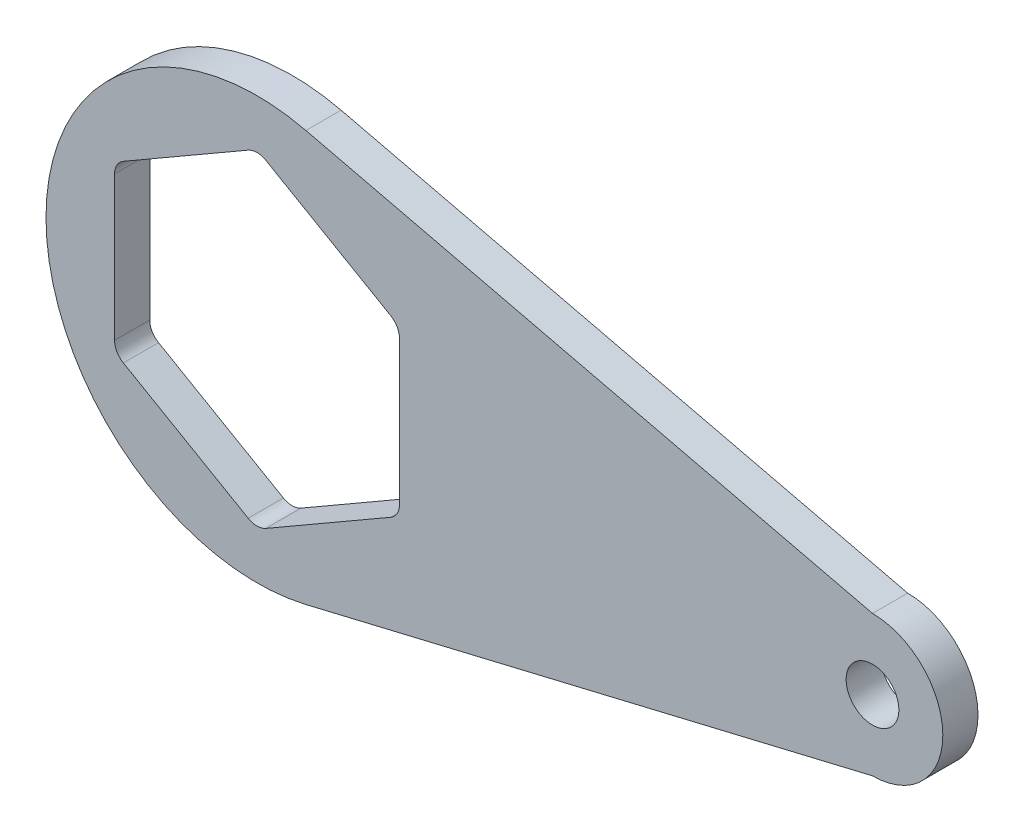
ISO-10303-21;
HEADER;
FILE_DESCRIPTION(('STEP AP214'),'2;1');
FILE_NAME('part.step','',(''),(''),'','','');
FILE_SCHEMA(('AUTOMOTIVE_DESIGN { 1 0 10303 214 1 1 1 1 }'));
ENDSEC;
DATA;
#1=APPLICATION_CONTEXT('core data for automotive mechanical design processes');
#2=APPLICATION_PROTOCOL_DEFINITION('international standard','automotive_design',2000,#1);
#3=PRODUCT_CONTEXT('',#1,'mechanical');
#4=PRODUCT('Part','Part','',(#3));
#5=PRODUCT_RELATED_PRODUCT_CATEGORY('part','',(#4));
#6=PRODUCT_DEFINITION_FORMATION('','',#4);
#7=PRODUCT_DEFINITION_CONTEXT('part definition',#1,'design');
#8=PRODUCT_DEFINITION('design','',#6,#7);
#9=PRODUCT_DEFINITION_SHAPE('','',#8);
#10=(LENGTH_UNIT() NAMED_UNIT(*) SI_UNIT(.MILLI.,.METRE.));
#11=(NAMED_UNIT(*) PLANE_ANGLE_UNIT() SI_UNIT($,.RADIAN.));
#12=(NAMED_UNIT(*) SI_UNIT($,.STERADIAN.) SOLID_ANGLE_UNIT());
#13=UNCERTAINTY_MEASURE_WITH_UNIT(LENGTH_MEASURE(1.E-05),#10,'distance_accuracy_value','');
#14=(GEOMETRIC_REPRESENTATION_CONTEXT(3) GLOBAL_UNCERTAINTY_ASSIGNED_CONTEXT((#13)) GLOBAL_UNIT_ASSIGNED_CONTEXT((#10,
#11,#12)) REPRESENTATION_CONTEXT('',''));
#15=CARTESIAN_POINT('',(0.,0.,0.));
#16=DIRECTION('',(0.,0.,1.));
#17=DIRECTION('',(1.,0.,0.));
#18=AXIS2_PLACEMENT_3D('',#15,#16,#17);
#19=CARTESIAN_POINT('',(175.,0.,10.));
#20=DIRECTION('',(0.,0.,1.));
#21=DIRECTION('',(1.,0.,0.));
#22=AXIS2_PLACEMENT_3D('',#19,#20,#21);
#23=PLANE('',#22);
#24=DIRECTION('',(0.,1.,0.));
#25=VECTOR('',#24,1.);
#26=CARTESIAN_POINT('',(40.5,-23.3826859021798,10.));
#27=LINE('',#26,#25);
#28=CARTESIAN_POINT('',(40.5,-20.4959345562317,10.));
#29=VERTEX_POINT('',#28);
#30=CARTESIAN_POINT('',(40.5,20.4959345562317,10.));
#31=VERTEX_POINT('',#30);
#32=EDGE_CURVE('E295',#29,#31,#27,.T.);
#33=ORIENTED_EDGE('',*,*,#32,.F.);
#34=CARTESIAN_POINT('',(35.5,-20.4959345562317,10.));
#35=DIRECTION('',(0.,0.,1.));
#36=DIRECTION('',(1.,0.,0.));
#37=AXIS2_PLACEMENT_3D('',#34,#35,#36);
#38=CIRCLE('',#37,5.);
#39=CARTESIAN_POINT('',(38.,-24.8260615751539,10.));
#40=VERTEX_POINT('',#39);
#41=EDGE_CURVE('E259',#29,#40,#38,.F.);
#42=ORIENTED_EDGE('',*,*,#41,.T.);
#43=DIRECTION('',(0.866025403784439,0.5,0.));
#44=VECTOR('',#43,1.);
#45=CARTESIAN_POINT('',(0.,-46.7653718043597,10.));
#46=LINE('',#45,#44);
#47=CARTESIAN_POINT('',(2.50000000000001,-45.3219961313856,10.));
#48=VERTEX_POINT('',#47);
#49=EDGE_CURVE('E312',#48,#40,#46,.T.);
#50=ORIENTED_EDGE('',*,*,#49,.F.);
#51=CARTESIAN_POINT('',(0.,-40.9918691124634,10.));
#52=DIRECTION('',(0.,0.,1.));
#53=DIRECTION('',(1.,0.,0.));
#54=AXIS2_PLACEMENT_3D('',#51,#52,#53);
#55=CIRCLE('',#54,5.);
#56=CARTESIAN_POINT('',(-2.5,-45.3219961313856,10.));
#57=VERTEX_POINT('',#56);
#58=EDGE_CURVE('E255',#48,#57,#55,.F.);
#59=ORIENTED_EDGE('',*,*,#58,.T.);
#60=DIRECTION('',(0.866025403784439,-0.5,0.));
#61=VECTOR('',#60,1.);
#62=CARTESIAN_POINT('',(-40.5,-23.3826859021799,10.));
#63=LINE('',#62,#61);
#64=CARTESIAN_POINT('',(-38.,-24.8260615751539,10.));
#65=VERTEX_POINT('',#64);
#66=EDGE_CURVE('E292',#65,#57,#63,.T.);
#67=ORIENTED_EDGE('',*,*,#66,.F.);
#68=CARTESIAN_POINT('',(-35.5,-20.4959345562317,10.));
#69=DIRECTION('',(0.,0.,1.));
#70=DIRECTION('',(1.,0.,0.));
#71=AXIS2_PLACEMENT_3D('',#68,#69,#70);
#72=CIRCLE('',#71,5.);
#73=CARTESIAN_POINT('',(-40.5,-20.4959345562317,10.));
#74=VERTEX_POINT('',#73);
#75=EDGE_CURVE('E251',#65,#74,#72,.F.);
#76=ORIENTED_EDGE('',*,*,#75,.T.);
#77=DIRECTION('',(0.,-1.,0.));
#78=VECTOR('',#77,1.);
#79=CARTESIAN_POINT('',(-40.5,23.3826859021798,10.));
#80=LINE('',#79,#78);
#81=CARTESIAN_POINT('',(-40.5,20.4959345562317,10.));
#82=VERTEX_POINT('',#81);
#83=EDGE_CURVE('E289',#82,#74,#80,.T.);
#84=ORIENTED_EDGE('',*,*,#83,.F.);
#85=CARTESIAN_POINT('',(-35.5,20.4959345562317,10.));
#86=DIRECTION('',(0.,0.,1.));
#87=DIRECTION('',(1.,0.,0.));
#88=AXIS2_PLACEMENT_3D('',#85,#86,#87);
#89=CIRCLE('',#88,5.);
#90=CARTESIAN_POINT('',(-38.,24.8260615751539,10.));
#91=VERTEX_POINT('',#90);
#92=EDGE_CURVE('E12',#82,#91,#89,.F.);
#93=ORIENTED_EDGE('',*,*,#92,.T.);
#94=DIRECTION('',(-0.866025403784438,-0.5,0.));
#95=VECTOR('',#94,1.);
#96=CARTESIAN_POINT('',(0.,46.7653718043597,10.));
#97=LINE('',#96,#95);
#98=CARTESIAN_POINT('',(-2.49999999999999,45.3219961313856,10.));
#99=VERTEX_POINT('',#98);
#100=EDGE_CURVE('E287',#99,#91,#97,.T.);
#101=ORIENTED_EDGE('',*,*,#100,.F.);
#102=CARTESIAN_POINT('',(0.,40.9918691124634,10.));
#103=DIRECTION('',(0.,0.,1.));
#104=DIRECTION('',(1.,0.,0.));
#105=AXIS2_PLACEMENT_3D('',#102,#103,#104);
#106=CIRCLE('',#105,5.);
#107=CARTESIAN_POINT('',(2.5,45.3219961313856,10.));
#108=VERTEX_POINT('',#107);
#109=EDGE_CURVE('E267',#99,#108,#106,.F.);
#110=ORIENTED_EDGE('',*,*,#109,.T.);
#111=DIRECTION('',(-0.866025403784439,0.5,0.));
#112=VECTOR('',#111,1.);
#113=CARTESIAN_POINT('',(40.5,23.3826859021798,10.));
#114=LINE('',#113,#112);
#115=CARTESIAN_POINT('',(38.,24.8260615751539,10.));
#116=VERTEX_POINT('',#115);
#117=EDGE_CURVE('E290',#116,#108,#114,.T.);
#118=ORIENTED_EDGE('',*,*,#117,.F.);
#119=CARTESIAN_POINT('',(35.5,20.4959345562317,10.));
#120=DIRECTION('',(0.,0.,1.));
#121=DIRECTION('',(1.,0.,0.));
#122=AXIS2_PLACEMENT_3D('',#119,#120,#121);
#123=CIRCLE('',#122,5.);
#124=EDGE_CURVE('E263',#116,#31,#123,.F.);
#125=ORIENTED_EDGE('',*,*,#124,.T.);
#126=EDGE_LOOP('',(#33,#42,#50,#59,#67,#76,#84,#93,#101,#110,#118,#125));
#127=FACE_BOUND('',#126,.T.);
#128=CARTESIAN_POINT('',(175.,0.,10.));
#129=DIRECTION('',(0.,0.,1.));
#130=DIRECTION('',(1.,0.,0.));
#131=AXIS2_PLACEMENT_3D('',#128,#129,#130);
#132=CIRCLE('',#131,20.);
#133=CARTESIAN_POINT('',(175.,-20.,10.));
#134=VERTEX_POINT('',#133);
#135=CARTESIAN_POINT('',(175.,20.,10.));
#136=VERTEX_POINT('',#135);
#137=EDGE_CURVE('E202',#134,#136,#132,.T.);
#138=ORIENTED_EDGE('',*,*,#137,.T.);
#139=DIRECTION('',(-0.972791830231703,0.231680933687805,0.));
#140=VECTOR('',#139,1.);
#141=CARTESIAN_POINT('',(175.,20.,10.));
#142=LINE('',#141,#140);
#143=CARTESIAN_POINT('',(13.9008560212683,58.3675098139022,10.));
#144=VERTEX_POINT('',#143);
#145=EDGE_CURVE('E191',#136,#144,#142,.T.);
#146=ORIENTED_EDGE('',*,*,#145,.T.);
#147=CARTESIAN_POINT('',(0.,0.,10.));
#148=DIRECTION('',(0.,0.,1.));
#149=DIRECTION('',(1.,0.,0.));
#150=AXIS2_PLACEMENT_3D('',#147,#148,#149);
#151=CIRCLE('',#150,60.);
#152=CARTESIAN_POINT('',(13.9008560212683,-58.3675098139022,10.));
#153=VERTEX_POINT('',#152);
#154=EDGE_CURVE('E201',#144,#153,#151,.T.);
#155=ORIENTED_EDGE('',*,*,#154,.T.);
#156=DIRECTION('',(-0.972791830231703,-0.231680933687805,0.));
#157=VECTOR('',#156,1.);
#158=CARTESIAN_POINT('',(175.,-20.,10.));
#159=LINE('',#158,#157);
#160=EDGE_CURVE('E208',#134,#153,#159,.T.);
#161=ORIENTED_EDGE('',*,*,#160,.F.);
#162=EDGE_LOOP('',(#138,#146,#155,#161));
#163=FACE_BOUND('',#162,.T.);
#164=CARTESIAN_POINT('',(175.,0.,10.));
#165=DIRECTION('',(0.,0.,1.));
#166=DIRECTION('',(1.,0.,0.));
#167=AXIS2_PLACEMENT_3D('',#164,#165,#166);
#168=CIRCLE('',#167,7.50000000000001);
#169=CARTESIAN_POINT('',(182.5,0.,10.));
#170=VERTEX_POINT('',#169);
#171=EDGE_CURVE('E305',#170,#170,#168,.T.);
#172=ORIENTED_EDGE('',*,*,#171,.F.);
#173=EDGE_LOOP('',(#172));
#174=FACE_BOUND('',#173,.T.);
#175=ADVANCED_FACE('F78',(#127,#163,#174),#23,.T.);
#176=CARTESIAN_POINT('',(175.,0.,0.));
#177=DIRECTION('',(0.,0.,1.));
#178=DIRECTION('',(1.,0.,0.));
#179=AXIS2_PLACEMENT_3D('',#176,#177,#178);
#180=PLANE('',#179);
#181=CARTESIAN_POINT('',(175.,0.,0.));
#182=DIRECTION('',(0.,0.,1.));
#183=DIRECTION('',(1.,0.,0.));
#184=AXIS2_PLACEMENT_3D('',#181,#182,#183);
#185=CIRCLE('',#184,20.);
#186=CARTESIAN_POINT('',(175.,-20.,0.));
#187=VERTEX_POINT('',#186);
#188=CARTESIAN_POINT('',(175.,20.,0.));
#189=VERTEX_POINT('',#188);
#190=EDGE_CURVE('E214',#187,#189,#185,.T.);
#191=ORIENTED_EDGE('',*,*,#190,.F.);
#192=DIRECTION('',(-0.972791830231703,-0.231680933687805,0.));
#193=VECTOR('',#192,1.);
#194=CARTESIAN_POINT('',(175.,-20.,0.));
#195=LINE('',#194,#193);
#196=CARTESIAN_POINT('',(13.9008560212683,-58.3675098139022,0.));
#197=VERTEX_POINT('',#196);
#198=EDGE_CURVE('E210',#187,#197,#195,.T.);
#199=ORIENTED_EDGE('',*,*,#198,.T.);
#200=CARTESIAN_POINT('',(0.,0.,0.));
#201=DIRECTION('',(0.,0.,1.));
#202=DIRECTION('',(1.,0.,0.));
#203=AXIS2_PLACEMENT_3D('',#200,#201,#202);
#204=CIRCLE('',#203,60.);
#205=CARTESIAN_POINT('',(13.9008560212683,58.3675098139022,0.));
#206=VERTEX_POINT('',#205);
#207=EDGE_CURVE('E320',#206,#197,#204,.T.);
#208=ORIENTED_EDGE('',*,*,#207,.F.);
#209=DIRECTION('',(-0.972791830231703,0.231680933687805,0.));
#210=VECTOR('',#209,1.);
#211=CARTESIAN_POINT('',(175.,20.,0.));
#212=LINE('',#211,#210);
#213=EDGE_CURVE('E318',#189,#206,#212,.T.);
#214=ORIENTED_EDGE('',*,*,#213,.F.);
#215=EDGE_LOOP('',(#191,#199,#208,#214));
#216=FACE_BOUND('',#215,.T.);
#217=DIRECTION('',(0.866025403784439,-0.5,0.));
#218=VECTOR('',#217,1.);
#219=CARTESIAN_POINT('',(-40.5,-23.3826859021799,0.));
#220=LINE('',#219,#218);
#221=CARTESIAN_POINT('',(-38.,-24.8260615751539,0.));
#222=VERTEX_POINT('',#221);
#223=CARTESIAN_POINT('',(-2.5,-45.3219961313856,0.));
#224=VERTEX_POINT('',#223);
#225=EDGE_CURVE('E284',#222,#224,#220,.T.);
#226=ORIENTED_EDGE('',*,*,#225,.T.);
#227=CARTESIAN_POINT('',(0.,-40.9918691124634,0.));
#228=DIRECTION('',(0.,0.,1.));
#229=DIRECTION('',(1.,0.,0.));
#230=AXIS2_PLACEMENT_3D('',#227,#228,#229);
#231=CIRCLE('',#230,5.);
#232=CARTESIAN_POINT('',(2.50000000000001,-45.3219961313856,0.));
#233=VERTEX_POINT('',#232);
#234=EDGE_CURVE('E253',#224,#233,#231,.T.);
#235=ORIENTED_EDGE('',*,*,#234,.T.);
#236=DIRECTION('',(0.866025403784439,0.5,0.));
#237=VECTOR('',#236,1.);
#238=CARTESIAN_POINT('',(0.,-46.7653718043597,0.));
#239=LINE('',#238,#237);
#240=CARTESIAN_POINT('',(38.,-24.8260615751539,0.));
#241=VERTEX_POINT('',#240);
#242=EDGE_CURVE('E301',#233,#241,#239,.T.);
#243=ORIENTED_EDGE('',*,*,#242,.T.);
#244=CARTESIAN_POINT('',(35.5,-20.4959345562317,0.));
#245=DIRECTION('',(0.,0.,1.));
#246=DIRECTION('',(1.,0.,0.));
#247=AXIS2_PLACEMENT_3D('',#244,#245,#246);
#248=CIRCLE('',#247,5.);
#249=CARTESIAN_POINT('',(40.5,-20.4959345562317,0.));
#250=VERTEX_POINT('',#249);
#251=EDGE_CURVE('E257',#241,#250,#248,.T.);
#252=ORIENTED_EDGE('',*,*,#251,.T.);
#253=DIRECTION('',(0.,1.,0.));
#254=VECTOR('',#253,1.);
#255=CARTESIAN_POINT('',(40.5,-23.3826859021798,0.));
#256=LINE('',#255,#254);
#257=CARTESIAN_POINT('',(40.5,20.4959345562317,0.));
#258=VERTEX_POINT('',#257);
#259=EDGE_CURVE('E304',#250,#258,#256,.T.);
#260=ORIENTED_EDGE('',*,*,#259,.T.);
#261=CARTESIAN_POINT('',(35.5,20.4959345562317,0.));
#262=DIRECTION('',(0.,0.,1.));
#263=DIRECTION('',(1.,0.,0.));
#264=AXIS2_PLACEMENT_3D('',#261,#262,#263);
#265=CIRCLE('',#264,5.);
#266=CARTESIAN_POINT('',(38.,24.8260615751539,0.));
#267=VERTEX_POINT('',#266);
#268=EDGE_CURVE('E261',#258,#267,#265,.T.);
#269=ORIENTED_EDGE('',*,*,#268,.T.);
#270=DIRECTION('',(-0.866025403784439,0.5,0.));
#271=VECTOR('',#270,1.);
#272=CARTESIAN_POINT('',(40.5,23.3826859021798,0.));
#273=LINE('',#272,#271);
#274=CARTESIAN_POINT('',(2.5,45.3219961313856,0.));
#275=VERTEX_POINT('',#274);
#276=EDGE_CURVE('E308',#267,#275,#273,.T.);
#277=ORIENTED_EDGE('',*,*,#276,.T.);
#278=CARTESIAN_POINT('',(0.,40.9918691124634,0.));
#279=DIRECTION('',(0.,0.,1.));
#280=DIRECTION('',(1.,0.,0.));
#281=AXIS2_PLACEMENT_3D('',#278,#279,#280);
#282=CIRCLE('',#281,5.);
#283=CARTESIAN_POINT('',(-2.49999999999999,45.3219961313856,0.));
#284=VERTEX_POINT('',#283);
#285=EDGE_CURVE('E265',#275,#284,#282,.T.);
#286=ORIENTED_EDGE('',*,*,#285,.T.);
#287=DIRECTION('',(-0.866025403784438,-0.5,0.));
#288=VECTOR('',#287,1.);
#289=CARTESIAN_POINT('',(0.,46.7653718043597,0.));
#290=LINE('',#289,#288);
#291=CARTESIAN_POINT('',(-38.,24.8260615751539,0.));
#292=VERTEX_POINT('',#291);
#293=EDGE_CURVE('E276',#284,#292,#290,.T.);
#294=ORIENTED_EDGE('',*,*,#293,.T.);
#295=CARTESIAN_POINT('',(-35.5,20.4959345562317,0.));
#296=DIRECTION('',(0.,0.,1.));
#297=DIRECTION('',(1.,0.,0.));
#298=AXIS2_PLACEMENT_3D('',#295,#296,#297);
#299=CIRCLE('',#298,5.);
#300=CARTESIAN_POINT('',(-40.5,20.4959345562317,0.));
#301=VERTEX_POINT('',#300);
#302=EDGE_CURVE('E86',#292,#301,#299,.T.);
#303=ORIENTED_EDGE('',*,*,#302,.T.);
#304=DIRECTION('',(0.,-1.,0.));
#305=VECTOR('',#304,1.);
#306=CARTESIAN_POINT('',(-40.5,23.3826859021798,0.));
#307=LINE('',#306,#305);
#308=CARTESIAN_POINT('',(-40.5,-20.4959345562317,0.));
#309=VERTEX_POINT('',#308);
#310=EDGE_CURVE('E275',#301,#309,#307,.T.);
#311=ORIENTED_EDGE('',*,*,#310,.T.);
#312=CARTESIAN_POINT('',(-35.5,-20.4959345562317,0.));
#313=DIRECTION('',(0.,0.,1.));
#314=DIRECTION('',(1.,0.,0.));
#315=AXIS2_PLACEMENT_3D('',#312,#313,#314);
#316=CIRCLE('',#315,5.);
#317=EDGE_CURVE('E249',#309,#222,#316,.T.);
#318=ORIENTED_EDGE('',*,*,#317,.T.);
#319=EDGE_LOOP('',(#226,#235,#243,#252,#260,#269,#277,#286,#294,#303,#311,#318));
#320=FACE_BOUND('',#319,.T.);
#321=CARTESIAN_POINT('',(175.,0.,0.));
#322=DIRECTION('',(0.,0.,1.));
#323=DIRECTION('',(1.,0.,0.));
#324=AXIS2_PLACEMENT_3D('',#321,#322,#323);
#325=CIRCLE('',#324,7.50000000000001);
#326=CARTESIAN_POINT('',(182.5,0.,0.));
#327=VERTEX_POINT('',#326);
#328=EDGE_CURVE('E390',#327,#327,#325,.T.);
#329=ORIENTED_EDGE('',*,*,#328,.T.);
#330=EDGE_LOOP('',(#329));
#331=FACE_BOUND('',#330,.T.);
#332=ADVANCED_FACE('F273',(#216,#320,#331),#180,.F.);
#333=CARTESIAN_POINT('',(175.,0.,10.));
#334=DIRECTION('',(0.,0.,-1.));
#335=DIRECTION('',(-1.,0.,0.));
#336=AXIS2_PLACEMENT_3D('',#333,#334,#335);
#337=CYLINDRICAL_SURFACE('',#336,20.);
#338=ORIENTED_EDGE('',*,*,#190,.T.);
#339=DIRECTION('',(0.,0.,-1.));
#340=VECTOR('',#339,1.);
#341=CARTESIAN_POINT('',(175.,20.,10.));
#342=LINE('',#341,#340);
#343=EDGE_CURVE('E195',#136,#189,#342,.T.);
#344=ORIENTED_EDGE('',*,*,#343,.F.);
#345=ORIENTED_EDGE('',*,*,#137,.F.);
#346=DIRECTION('',(0.,0.,-1.));
#347=VECTOR('',#346,1.);
#348=CARTESIAN_POINT('',(175.,-20.,10.));
#349=LINE('',#348,#347);
#350=EDGE_CURVE('E316',#134,#187,#349,.T.);
#351=ORIENTED_EDGE('',*,*,#350,.T.);
#352=EDGE_LOOP('',(#338,#344,#345,#351));
#353=FACE_BOUND('',#352,.T.);
#354=ADVANCED_FACE('F212',(#353),#337,.T.);
#355=CARTESIAN_POINT('',(175.,20.,10.));
#356=DIRECTION('',(-0.231680933687805,-0.972791830231703,0.));
#357=DIRECTION('',(0.972791830231703,-0.231680933687805,0.));
#358=AXIS2_PLACEMENT_3D('',#355,#356,#357);
#359=PLANE('',#358);
#360=ORIENTED_EDGE('',*,*,#213,.T.);
#361=DIRECTION('',(0.,0.,-1.));
#362=VECTOR('',#361,1.);
#363=CARTESIAN_POINT('',(13.9008560212683,58.3675098139022,10.));
#364=LINE('',#363,#362);
#365=EDGE_CURVE('E198',#144,#206,#364,.T.);
#366=ORIENTED_EDGE('',*,*,#365,.F.);
#367=ORIENTED_EDGE('',*,*,#145,.F.);
#368=ORIENTED_EDGE('',*,*,#343,.T.);
#369=EDGE_LOOP('',(#360,#366,#367,#368));
#370=FACE_BOUND('',#369,.T.);
#371=ADVANCED_FACE('F193',(#370),#359,.F.);
#372=CARTESIAN_POINT('',(0.,0.,10.));
#373=DIRECTION('',(0.,0.,-1.));
#374=DIRECTION('',(-1.,0.,0.));
#375=AXIS2_PLACEMENT_3D('',#372,#373,#374);
#376=CYLINDRICAL_SURFACE('',#375,60.);
#377=ORIENTED_EDGE('',*,*,#207,.T.);
#378=DIRECTION('',(0.,0.,-1.));
#379=VECTOR('',#378,1.);
#380=CARTESIAN_POINT('',(13.9008560212683,-58.3675098139022,10.));
#381=LINE('',#380,#379);
#382=EDGE_CURVE('E219',#153,#197,#381,.T.);
#383=ORIENTED_EDGE('',*,*,#382,.F.);
#384=ORIENTED_EDGE('',*,*,#154,.F.);
#385=ORIENTED_EDGE('',*,*,#365,.T.);
#386=EDGE_LOOP('',(#377,#383,#384,#385));
#387=FACE_BOUND('',#386,.T.);
#388=ADVANCED_FACE('F331',(#387),#376,.T.);
#389=CARTESIAN_POINT('',(175.,-20.,10.));
#390=DIRECTION('',(0.231680933687805,-0.972791830231703,0.));
#391=DIRECTION('',(0.972791830231703,0.231680933687805,0.));
#392=AXIS2_PLACEMENT_3D('',#389,#390,#391);
#393=PLANE('',#392);
#394=ORIENTED_EDGE('',*,*,#198,.F.);
#395=ORIENTED_EDGE('',*,*,#350,.F.);
#396=ORIENTED_EDGE('',*,*,#160,.T.);
#397=ORIENTED_EDGE('',*,*,#382,.T.);
#398=EDGE_LOOP('',(#394,#395,#396,#397));
#399=FACE_BOUND('',#398,.T.);
#400=ADVANCED_FACE('F328',(#399),#393,.T.);
#401=CARTESIAN_POINT('',(0.,-46.7653718043597,10.));
#402=DIRECTION('',(-0.5,0.866025403784438,0.));
#403=DIRECTION('',(-0.866025403784439,-0.5,0.));
#404=AXIS2_PLACEMENT_3D('',#401,#402,#403);
#405=PLANE('',#404);
#406=ORIENTED_EDGE('',*,*,#242,.F.);
#407=DIRECTION('',(0.,0.,-1.));
#408=VECTOR('',#407,1.);
#409=CARTESIAN_POINT('',(2.50000000000001,-45.3219961313856,10.));
#410=LINE('',#409,#408);
#411=EDGE_CURVE('E233',#233,#48,#410,.F.);
#412=ORIENTED_EDGE('',*,*,#411,.T.);
#413=ORIENTED_EDGE('',*,*,#49,.T.);
#414=DIRECTION('',(0.,0.,-1.));
#415=VECTOR('',#414,1.);
#416=CARTESIAN_POINT('',(38.,-24.8260615751539,0.));
#417=LINE('',#416,#415);
#418=EDGE_CURVE('E230',#40,#241,#417,.T.);
#419=ORIENTED_EDGE('',*,*,#418,.T.);
#420=EDGE_LOOP('',(#406,#412,#413,#419));
#421=FACE_BOUND('',#420,.T.);
#422=ADVANCED_FACE('F345',(#421),#405,.T.);
#423=CARTESIAN_POINT('',(40.5,-23.3826859021798,10.));
#424=DIRECTION('',(-1.,0.,0.));
#425=DIRECTION('',(0.,-1.,0.));
#426=AXIS2_PLACEMENT_3D('',#423,#424,#425);
#427=PLANE('',#426);
#428=ORIENTED_EDGE('',*,*,#259,.F.);
#429=DIRECTION('',(0.,0.,-1.));
#430=VECTOR('',#429,1.);
#431=CARTESIAN_POINT('',(40.5,-20.4959345562317,10.));
#432=LINE('',#431,#430);
#433=EDGE_CURVE('E238',#250,#29,#432,.F.);
#434=ORIENTED_EDGE('',*,*,#433,.T.);
#435=ORIENTED_EDGE('',*,*,#32,.T.);
#436=DIRECTION('',(0.,0.,-1.));
#437=VECTOR('',#436,1.);
#438=CARTESIAN_POINT('',(40.5,20.4959345562317,0.));
#439=LINE('',#438,#437);
#440=EDGE_CURVE('E235',#31,#258,#439,.T.);
#441=ORIENTED_EDGE('',*,*,#440,.T.);
#442=EDGE_LOOP('',(#428,#434,#435,#441));
#443=FACE_BOUND('',#442,.T.);
#444=ADVANCED_FACE('F385',(#443),#427,.T.);
#445=CARTESIAN_POINT('',(40.5,23.3826859021798,10.));
#446=DIRECTION('',(-0.5,-0.866025403784439,0.));
#447=DIRECTION('',(0.866025403784439,-0.5,0.));
#448=AXIS2_PLACEMENT_3D('',#445,#446,#447);
#449=PLANE('',#448);
#450=ORIENTED_EDGE('',*,*,#276,.F.);
#451=DIRECTION('',(0.,0.,-1.));
#452=VECTOR('',#451,1.);
#453=CARTESIAN_POINT('',(38.,24.8260615751539,10.));
#454=LINE('',#453,#452);
#455=EDGE_CURVE('E243',#267,#116,#454,.F.);
#456=ORIENTED_EDGE('',*,*,#455,.T.);
#457=ORIENTED_EDGE('',*,*,#117,.T.);
#458=DIRECTION('',(0.,0.,-1.));
#459=VECTOR('',#458,1.);
#460=CARTESIAN_POINT('',(2.5,45.3219961313856,0.));
#461=LINE('',#460,#459);
#462=EDGE_CURVE('E240',#108,#275,#461,.T.);
#463=ORIENTED_EDGE('',*,*,#462,.T.);
#464=EDGE_LOOP('',(#450,#456,#457,#463));
#465=FACE_BOUND('',#464,.T.);
#466=ADVANCED_FACE('F378',(#465),#449,.T.);
#467=CARTESIAN_POINT('',(0.,46.7653718043597,10.));
#468=DIRECTION('',(0.5,-0.866025403784438,0.));
#469=DIRECTION('',(0.866025403784438,0.500000000000001,0.));
#470=AXIS2_PLACEMENT_3D('',#467,#468,#469);
#471=PLANE('',#470);
#472=ORIENTED_EDGE('',*,*,#293,.F.);
#473=DIRECTION('',(0.,0.,-1.));
#474=VECTOR('',#473,1.);
#475=CARTESIAN_POINT('',(-2.49999999999999,45.3219961313856,10.));
#476=LINE('',#475,#474);
#477=EDGE_CURVE('E98',#284,#99,#476,.F.);
#478=ORIENTED_EDGE('',*,*,#477,.T.);
#479=ORIENTED_EDGE('',*,*,#100,.T.);
#480=DIRECTION('',(0.,0.,-1.));
#481=VECTOR('',#480,1.);
#482=CARTESIAN_POINT('',(-38.,24.8260615751539,0.));
#483=LINE('',#482,#481);
#484=EDGE_CURVE('E245',#91,#292,#483,.T.);
#485=ORIENTED_EDGE('',*,*,#484,.T.);
#486=EDGE_LOOP('',(#472,#478,#479,#485));
#487=FACE_BOUND('',#486,.T.);
#488=ADVANCED_FACE('F286',(#487),#471,.T.);
#489=CARTESIAN_POINT('',(-40.5,23.3826859021798,10.));
#490=DIRECTION('',(1.,0.,0.));
#491=DIRECTION('',(0.,1.,0.));
#492=AXIS2_PLACEMENT_3D('',#489,#490,#491);
#493=PLANE('',#492);
#494=ORIENTED_EDGE('',*,*,#83,.T.);
#495=DIRECTION('',(0.,0.,-1.));
#496=VECTOR('',#495,1.);
#497=CARTESIAN_POINT('',(-40.5,-20.4959345562317,0.));
#498=LINE('',#497,#496);
#499=EDGE_CURVE('E217',#74,#309,#498,.T.);
#500=ORIENTED_EDGE('',*,*,#499,.T.);
#501=ORIENTED_EDGE('',*,*,#310,.F.);
#502=DIRECTION('',(0.,0.,-1.));
#503=VECTOR('',#502,1.);
#504=CARTESIAN_POINT('',(-40.5,20.4959345562317,10.));
#505=LINE('',#504,#503);
#506=EDGE_CURVE('E215',#301,#82,#505,.F.);
#507=ORIENTED_EDGE('',*,*,#506,.T.);
#508=EDGE_LOOP('',(#494,#500,#501,#507));
#509=FACE_BOUND('',#508,.T.);
#510=ADVANCED_FACE('F282',(#509),#493,.T.);
#511=CARTESIAN_POINT('',(-40.5,-23.3826859021799,10.));
#512=DIRECTION('',(0.5,0.866025403784439,0.));
#513=DIRECTION('',(-0.866025403784439,0.5,0.));
#514=AXIS2_PLACEMENT_3D('',#511,#512,#513);
#515=PLANE('',#514);
#516=ORIENTED_EDGE('',*,*,#225,.F.);
#517=DIRECTION('',(0.,0.,-1.));
#518=VECTOR('',#517,1.);
#519=CARTESIAN_POINT('',(-38.,-24.8260615751539,10.));
#520=LINE('',#519,#518);
#521=EDGE_CURVE('E228',#222,#65,#520,.F.);
#522=ORIENTED_EDGE('',*,*,#521,.T.);
#523=ORIENTED_EDGE('',*,*,#66,.T.);
#524=DIRECTION('',(0.,0.,-1.));
#525=VECTOR('',#524,1.);
#526=CARTESIAN_POINT('',(-2.49999999999999,-45.3219961313856,0.));
#527=LINE('',#526,#525);
#528=EDGE_CURVE('E225',#57,#224,#527,.T.);
#529=ORIENTED_EDGE('',*,*,#528,.T.);
#530=EDGE_LOOP('',(#516,#522,#523,#529));
#531=FACE_BOUND('',#530,.T.);
#532=ADVANCED_FACE('F398',(#531),#515,.T.);
#533=CARTESIAN_POINT('',(175.,0.,10.));
#534=DIRECTION('',(0.,0.,-1.));
#535=DIRECTION('',(-1.,0.,0.));
#536=AXIS2_PLACEMENT_3D('',#533,#534,#535);
#537=CYLINDRICAL_SURFACE('',#536,7.50000000000001);
#538=ORIENTED_EDGE('',*,*,#171,.T.);
#539=EDGE_LOOP('',(#538));
#540=FACE_BOUND('',#539,.T.);
#541=ORIENTED_EDGE('',*,*,#328,.F.);
#542=EDGE_LOOP('',(#541));
#543=FACE_BOUND('',#542,.T.);
#544=ADVANCED_FACE('F354',(#540,#543),#537,.F.);
#545=CARTESIAN_POINT('',(-35.5,-20.4959345562317,10.));
#546=DIRECTION('',(0.,0.,1.));
#547=DIRECTION('',(1.,0.,0.));
#548=AXIS2_PLACEMENT_3D('',#545,#546,#547);
#549=CYLINDRICAL_SURFACE('',#548,5.);
#550=ORIENTED_EDGE('',*,*,#75,.F.);
#551=ORIENTED_EDGE('',*,*,#521,.F.);
#552=ORIENTED_EDGE('',*,*,#317,.F.);
#553=ORIENTED_EDGE('',*,*,#499,.F.);
#554=EDGE_LOOP('',(#550,#551,#552,#553));
#555=FACE_BOUND('',#554,.T.);
#556=ADVANCED_FACE('F350',(#555),#549,.F.);
#557=CARTESIAN_POINT('',(0.,-40.9918691124634,10.));
#558=DIRECTION('',(0.,0.,1.));
#559=DIRECTION('',(1.,0.,0.));
#560=AXIS2_PLACEMENT_3D('',#557,#558,#559);
#561=CYLINDRICAL_SURFACE('',#560,5.);
#562=ORIENTED_EDGE('',*,*,#58,.F.);
#563=ORIENTED_EDGE('',*,*,#411,.F.);
#564=ORIENTED_EDGE('',*,*,#234,.F.);
#565=ORIENTED_EDGE('',*,*,#528,.F.);
#566=EDGE_LOOP('',(#562,#563,#564,#565));
#567=FACE_BOUND('',#566,.T.);
#568=ADVANCED_FACE('F353',(#567),#561,.F.);
#569=CARTESIAN_POINT('',(35.5,-20.4959345562317,10.));
#570=DIRECTION('',(0.,0.,1.));
#571=DIRECTION('',(1.,0.,0.));
#572=AXIS2_PLACEMENT_3D('',#569,#570,#571);
#573=CYLINDRICAL_SURFACE('',#572,5.);
#574=ORIENTED_EDGE('',*,*,#41,.F.);
#575=ORIENTED_EDGE('',*,*,#433,.F.);
#576=ORIENTED_EDGE('',*,*,#251,.F.);
#577=ORIENTED_EDGE('',*,*,#418,.F.);
#578=EDGE_LOOP('',(#574,#575,#576,#577));
#579=FACE_BOUND('',#578,.T.);
#580=ADVANCED_FACE('F358',(#579),#573,.F.);
#581=CARTESIAN_POINT('',(35.5,20.4959345562317,10.));
#582=DIRECTION('',(0.,0.,1.));
#583=DIRECTION('',(1.,0.,0.));
#584=AXIS2_PLACEMENT_3D('',#581,#582,#583);
#585=CYLINDRICAL_SURFACE('',#584,5.);
#586=ORIENTED_EDGE('',*,*,#124,.F.);
#587=ORIENTED_EDGE('',*,*,#455,.F.);
#588=ORIENTED_EDGE('',*,*,#268,.F.);
#589=ORIENTED_EDGE('',*,*,#440,.F.);
#590=EDGE_LOOP('',(#586,#587,#588,#589));
#591=FACE_BOUND('',#590,.T.);
#592=ADVANCED_FACE('F362',(#591),#585,.F.);
#593=CARTESIAN_POINT('',(0.,40.9918691124634,10.));
#594=DIRECTION('',(0.,0.,1.));
#595=DIRECTION('',(1.,0.,0.));
#596=AXIS2_PLACEMENT_3D('',#593,#594,#595);
#597=CYLINDRICAL_SURFACE('',#596,5.);
#598=ORIENTED_EDGE('',*,*,#109,.F.);
#599=ORIENTED_EDGE('',*,*,#477,.F.);
#600=ORIENTED_EDGE('',*,*,#285,.F.);
#601=ORIENTED_EDGE('',*,*,#462,.F.);
#602=EDGE_LOOP('',(#598,#599,#600,#601));
#603=FACE_BOUND('',#602,.T.);
#604=ADVANCED_FACE('F365',(#603),#597,.F.);
#605=CARTESIAN_POINT('',(-35.5,20.4959345562317,10.));
#606=DIRECTION('',(0.,0.,1.));
#607=DIRECTION('',(1.,0.,0.));
#608=AXIS2_PLACEMENT_3D('',#605,#606,#607);
#609=CYLINDRICAL_SURFACE('',#608,5.);
#610=ORIENTED_EDGE('',*,*,#92,.F.);
#611=ORIENTED_EDGE('',*,*,#506,.F.);
#612=ORIENTED_EDGE('',*,*,#302,.F.);
#613=ORIENTED_EDGE('',*,*,#484,.F.);
#614=EDGE_LOOP('',(#610,#611,#612,#613));
#615=FACE_BOUND('',#614,.T.);
#616=ADVANCED_FACE('F80',(#615),#609,.F.);
#617=CLOSED_SHELL('',(#175,#332,#354,#371,#388,#400,#422,#444,#466,#488,#510,#532,#544,#556,
#568,#580,#592,#604,#616));
#618=MANIFOLD_SOLID_BREP('B2',#617);
#619=ADVANCED_BREP_SHAPE_REPRESENTATION('',(#18,#618),#14);
#620=SHAPE_DEFINITION_REPRESENTATION(#9,#619);
ENDSEC;
END-ISO-10303-21;
